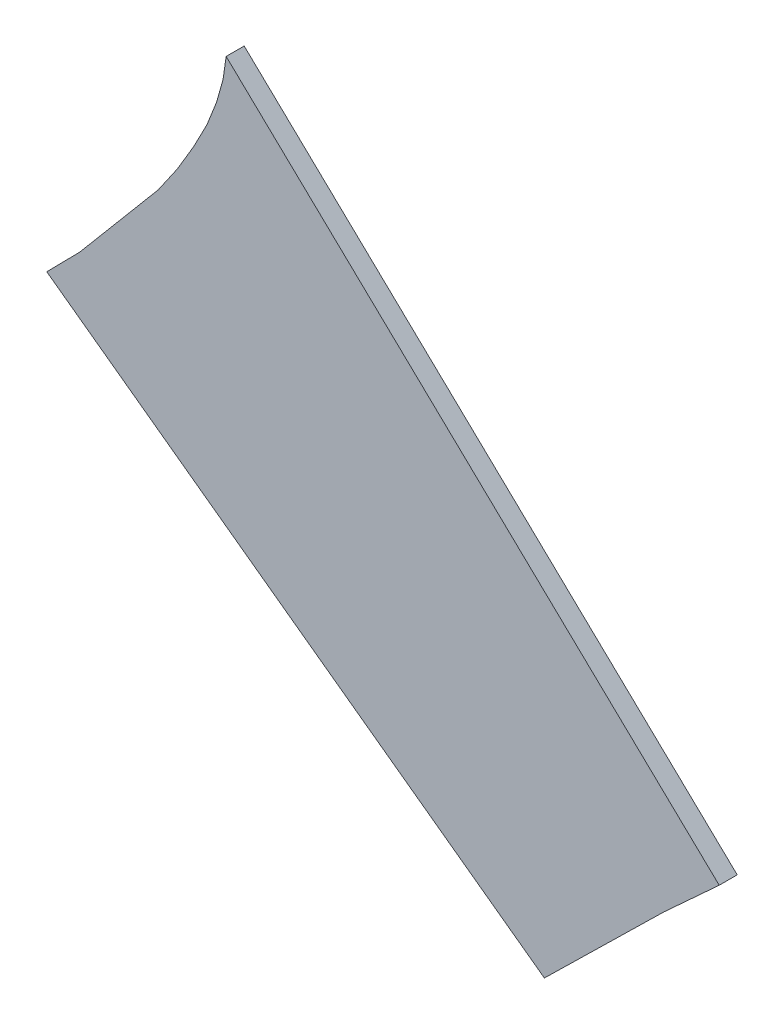
ISO-10303-21;
HEADER;
FILE_DESCRIPTION(('STEP AP214'),'2;1');
FILE_NAME('part.step','',(''),(''),'','','');
FILE_SCHEMA(('AUTOMOTIVE_DESIGN { 1 0 10303 214 1 1 1 1 }'));
ENDSEC;
DATA;
#1=APPLICATION_CONTEXT('core data for automotive mechanical design processes');
#2=APPLICATION_PROTOCOL_DEFINITION('international standard','automotive_design',2000,#1);
#3=PRODUCT_CONTEXT('',#1,'mechanical');
#4=PRODUCT('Part','Part','',(#3));
#5=PRODUCT_RELATED_PRODUCT_CATEGORY('part','',(#4));
#6=PRODUCT_DEFINITION_FORMATION('','',#4);
#7=PRODUCT_DEFINITION_CONTEXT('part definition',#1,'design');
#8=PRODUCT_DEFINITION('design','',#6,#7);
#9=PRODUCT_DEFINITION_SHAPE('','',#8);
#10=(LENGTH_UNIT() NAMED_UNIT(*) SI_UNIT(.MILLI.,.METRE.));
#11=(NAMED_UNIT(*) PLANE_ANGLE_UNIT() SI_UNIT($,.RADIAN.));
#12=(NAMED_UNIT(*) SI_UNIT($,.STERADIAN.) SOLID_ANGLE_UNIT());
#13=UNCERTAINTY_MEASURE_WITH_UNIT(LENGTH_MEASURE(1.E-05),#10,'distance_accuracy_value','');
#14=(GEOMETRIC_REPRESENTATION_CONTEXT(3) GLOBAL_UNCERTAINTY_ASSIGNED_CONTEXT((#13)) GLOBAL_UNIT_ASSIGNED_CONTEXT((#10,
#11,#12)) REPRESENTATION_CONTEXT('',''));
#15=CARTESIAN_POINT('',(0.,0.,0.));
#16=DIRECTION('',(0.,0.,1.));
#17=DIRECTION('',(1.,0.,0.));
#18=AXIS2_PLACEMENT_3D('',#15,#16,#17);
#19=CARTESIAN_POINT('',(85.4899978637695,105.611000061035,0.));
#20=DIRECTION('',(-0.699500203064892,0.714632399148104,0.));
#21=DIRECTION('',(0.714632399148104,0.699500203064892,0.));
#22=AXIS2_PLACEMENT_3D('',#19,#20,#21);
#23=PLANE('',#22);
#24=DIRECTION('',(0.714632399148104,0.699500203064892,0.));
#25=VECTOR('',#24,1.);
#26=CARTESIAN_POINT('',(85.4899978637695,105.611000061035,0.03556));
#27=LINE('',#26,#25);
#28=CARTESIAN_POINT('',(85.4899978637695,105.611000061035,0.03556));
#29=VERTEX_POINT('',#28);
#30=CARTESIAN_POINT('',(85.7259979248047,105.842002868652,0.03556));
#31=VERTEX_POINT('',#30);
#32=EDGE_CURVE('E11',#29,#31,#27,.T.);
#33=ORIENTED_EDGE('',*,*,#32,.F.);
#34=DIRECTION('',(0.,0.,1.));
#35=VECTOR('',#34,1.);
#36=CARTESIAN_POINT('',(85.4899978637695,105.611000061035,0.));
#37=LINE('',#36,#35);
#38=CARTESIAN_POINT('',(85.4899978637695,105.611000061035,0.));
#39=VERTEX_POINT('',#38);
#40=EDGE_CURVE('E24',#39,#29,#37,.T.);
#41=ORIENTED_EDGE('',*,*,#40,.F.);
#42=DIRECTION('',(0.714632399148104,0.699500203064892,0.));
#43=VECTOR('',#42,1.);
#44=CARTESIAN_POINT('',(85.4899978637695,105.611000061035,0.));
#45=LINE('',#44,#43);
#46=CARTESIAN_POINT('',(85.7259979248047,105.842002868652,0.));
#47=VERTEX_POINT('',#46);
#48=EDGE_CURVE('E124',#39,#47,#45,.T.);
#49=ORIENTED_EDGE('',*,*,#48,.T.);
#50=DIRECTION('',(0.,0.,1.));
#51=VECTOR('',#50,1.);
#52=CARTESIAN_POINT('',(85.7259979248047,105.842002868652,0.));
#53=LINE('',#52,#51);
#54=EDGE_CURVE('E37',#47,#31,#53,.T.);
#55=ORIENTED_EDGE('',*,*,#54,.T.);
#56=EDGE_LOOP('',(#33,#41,#49,#55));
#57=FACE_BOUND('',#56,.T.);
#58=ADVANCED_FACE('F17',(#57),#23,.F.);
#59=CARTESIAN_POINT('',(85.7259979248047,105.842002868652,0.));
#60=DIRECTION('',(-0.676021190858393,0.736882181566633,0.));
#61=DIRECTION('',(0.736882181566633,0.676021190858393,0.));
#62=AXIS2_PLACEMENT_3D('',#59,#60,#61);
#63=PLANE('',#62);
#64=DIRECTION('',(0.736882181566633,0.676021190858393,0.));
#65=VECTOR('',#64,1.);
#66=CARTESIAN_POINT('',(85.7259979248047,105.842002868652,0.03556));
#67=LINE('',#66,#65);
#68=CARTESIAN_POINT('',(85.8349990844727,105.942001342773,0.03556));
#69=VERTEX_POINT('',#68);
#70=EDGE_CURVE('E196',#31,#69,#67,.T.);
#71=ORIENTED_EDGE('',*,*,#70,.F.);
#72=ORIENTED_EDGE('',*,*,#54,.F.);
#73=DIRECTION('',(0.736882181566633,0.676021190858393,0.));
#74=VECTOR('',#73,1.);
#75=CARTESIAN_POINT('',(85.7259979248047,105.842002868652,0.));
#76=LINE('',#75,#74);
#77=CARTESIAN_POINT('',(85.8349990844727,105.942001342773,0.));
#78=VERTEX_POINT('',#77);
#79=EDGE_CURVE('E193',#47,#78,#76,.T.);
#80=ORIENTED_EDGE('',*,*,#79,.T.);
#81=DIRECTION('',(0.,0.,1.));
#82=VECTOR('',#81,1.);
#83=CARTESIAN_POINT('',(85.8349990844727,105.942001342773,0.));
#84=LINE('',#83,#82);
#85=EDGE_CURVE('E191',#78,#69,#84,.T.);
#86=ORIENTED_EDGE('',*,*,#85,.T.);
#87=EDGE_LOOP('',(#71,#72,#80,#86));
#88=FACE_BOUND('',#87,.T.);
#89=ADVANCED_FACE('F204',(#88),#63,.F.);
#90=CARTESIAN_POINT('',(85.8349990844727,105.942001342773,0.));
#91=DIRECTION('',(-0.690952974262261,-0.722899707676062,0.));
#92=DIRECTION('',(-0.722899707676062,0.690952974262261,0.));
#93=AXIS2_PLACEMENT_3D('',#90,#91,#92);
#94=PLANE('',#93);
#95=DIRECTION('',(-0.722899707676062,0.690952974262261,0.));
#96=VECTOR('',#95,1.);
#97=CARTESIAN_POINT('',(85.8349990844727,105.942001342773,0.03556));
#98=LINE('',#97,#96);
#99=CARTESIAN_POINT('',(84.8619995117187,106.872001647949,0.03556));
#100=VERTEX_POINT('',#99);
#101=EDGE_CURVE('E188',#69,#100,#98,.T.);
#102=ORIENTED_EDGE('',*,*,#101,.F.);
#103=ORIENTED_EDGE('',*,*,#85,.F.);
#104=DIRECTION('',(-0.722899707676062,0.690952974262261,0.));
#105=VECTOR('',#104,1.);
#106=CARTESIAN_POINT('',(85.8349990844727,105.942001342773,0.));
#107=LINE('',#106,#105);
#108=CARTESIAN_POINT('',(84.8619995117187,106.872001647949,0.));
#109=VERTEX_POINT('',#108);
#110=EDGE_CURVE('E185',#78,#109,#107,.T.);
#111=ORIENTED_EDGE('',*,*,#110,.T.);
#112=DIRECTION('',(0.,0.,1.));
#113=VECTOR('',#112,1.);
#114=CARTESIAN_POINT('',(84.8619995117187,106.872001647949,0.));
#115=LINE('',#114,#113);
#116=EDGE_CURVE('E183',#109,#100,#115,.T.);
#117=ORIENTED_EDGE('',*,*,#116,.T.);
#118=EDGE_LOOP('',(#102,#103,#111,#117));
#119=FACE_BOUND('',#118,.T.);
#120=ADVANCED_FACE('F210',(#119),#94,.F.);
#121=CARTESIAN_POINT('',(84.8619995117188,106.872001647949,0.));
#122=DIRECTION('',(0.989960280537772,-0.141345827520925,0.));
#123=DIRECTION('',(-0.141345827520925,-0.989960280537772,0.));
#124=AXIS2_PLACEMENT_3D('',#121,#122,#123);
#125=PLANE('',#124);
#126=DIRECTION('',(-0.141345827520925,-0.989960280537772,0.));
#127=VECTOR('',#126,1.);
#128=CARTESIAN_POINT('',(84.8619995117187,106.872001647949,0.03556));
#129=LINE('',#128,#127);
#130=CARTESIAN_POINT('',(84.8560028076172,106.830001831055,0.03556));
#131=VERTEX_POINT('',#130);
#132=EDGE_CURVE('E180',#100,#131,#129,.T.);
#133=ORIENTED_EDGE('',*,*,#132,.F.);
#134=ORIENTED_EDGE('',*,*,#116,.F.);
#135=DIRECTION('',(-0.141345827520925,-0.989960280537772,0.));
#136=VECTOR('',#135,1.);
#137=CARTESIAN_POINT('',(84.8619995117187,106.872001647949,0.));
#138=LINE('',#137,#136);
#139=CARTESIAN_POINT('',(84.8560028076172,106.830001831055,0.));
#140=VERTEX_POINT('',#139);
#141=EDGE_CURVE('E177',#109,#140,#138,.T.);
#142=ORIENTED_EDGE('',*,*,#141,.T.);
#143=DIRECTION('',(0.,0.,1.));
#144=VECTOR('',#143,1.);
#145=CARTESIAN_POINT('',(84.8560028076172,106.830001831055,0.));
#146=LINE('',#145,#144);
#147=EDGE_CURVE('E175',#140,#131,#146,.T.);
#148=ORIENTED_EDGE('',*,*,#147,.T.);
#149=EDGE_LOOP('',(#133,#134,#142,#148));
#150=FACE_BOUND('',#149,.T.);
#151=ADVANCED_FACE('F212',(#150),#125,.F.);
#152=CARTESIAN_POINT('',(84.8560028076172,106.830001831055,0.));
#153=DIRECTION('',(0.962314850552555,-0.271937728912364,0.));
#154=DIRECTION('',(-0.271937728912364,-0.962314850552555,0.));
#155=AXIS2_PLACEMENT_3D('',#152,#153,#154);
#156=PLANE('',#155);
#157=DIRECTION('',(-0.271937728912364,-0.962314850552555,0.));
#158=VECTOR('',#157,1.);
#159=CARTESIAN_POINT('',(84.8560028076172,106.830001831055,0.03556));
#160=LINE('',#159,#158);
#161=CARTESIAN_POINT('',(84.8430023193359,106.783996582031,0.03556));
#162=VERTEX_POINT('',#161);
#163=EDGE_CURVE('E172',#131,#162,#160,.T.);
#164=ORIENTED_EDGE('',*,*,#163,.F.);
#165=ORIENTED_EDGE('',*,*,#147,.F.);
#166=DIRECTION('',(-0.271937728912364,-0.962314850552555,0.));
#167=VECTOR('',#166,1.);
#168=CARTESIAN_POINT('',(84.8560028076172,106.830001831055,0.));
#169=LINE('',#168,#167);
#170=CARTESIAN_POINT('',(84.8430023193359,106.783996582031,0.));
#171=VERTEX_POINT('',#170);
#172=EDGE_CURVE('E169',#140,#171,#169,.T.);
#173=ORIENTED_EDGE('',*,*,#172,.T.);
#174=DIRECTION('',(0.,0.,1.));
#175=VECTOR('',#174,1.);
#176=CARTESIAN_POINT('',(84.8430023193359,106.783996582031,0.));
#177=LINE('',#176,#175);
#178=EDGE_CURVE('E167',#171,#162,#177,.T.);
#179=ORIENTED_EDGE('',*,*,#178,.T.);
#180=EDGE_LOOP('',(#164,#165,#173,#179));
#181=FACE_BOUND('',#180,.T.);
#182=ADVANCED_FACE('F217',(#181),#156,.F.);
#183=CARTESIAN_POINT('',(84.8430023193359,106.783996582031,0.));
#184=DIRECTION('',(0.929765513623229,-0.368152264256154,0.));
#185=DIRECTION('',(-0.368152264256154,-0.929765513623229,0.));
#186=AXIS2_PLACEMENT_3D('',#183,#184,#185);
#187=PLANE('',#186);
#188=DIRECTION('',(-0.368152264256154,-0.929765513623229,0.));
#189=VECTOR('',#188,1.);
#190=CARTESIAN_POINT('',(84.8430023193359,106.783996582031,0.03556));
#191=LINE('',#190,#189);
#192=CARTESIAN_POINT('',(84.8239974975586,106.736000061035,0.03556));
#193=VERTEX_POINT('',#192);
#194=EDGE_CURVE('E164',#162,#193,#191,.T.);
#195=ORIENTED_EDGE('',*,*,#194,.F.);
#196=ORIENTED_EDGE('',*,*,#178,.F.);
#197=DIRECTION('',(-0.368152264256154,-0.929765513623229,0.));
#198=VECTOR('',#197,1.);
#199=CARTESIAN_POINT('',(84.8430023193359,106.783996582031,0.));
#200=LINE('',#199,#198);
#201=CARTESIAN_POINT('',(84.8239974975586,106.736000061035,0.));
#202=VERTEX_POINT('',#201);
#203=EDGE_CURVE('E161',#171,#202,#200,.T.);
#204=ORIENTED_EDGE('',*,*,#203,.T.);
#205=DIRECTION('',(0.,0.,1.));
#206=VECTOR('',#205,1.);
#207=CARTESIAN_POINT('',(84.8239974975586,106.736000061035,0.));
#208=LINE('',#207,#206);
#209=EDGE_CURVE('E159',#202,#193,#208,.T.);
#210=ORIENTED_EDGE('',*,*,#209,.T.);
#211=EDGE_LOOP('',(#195,#196,#204,#210));
#212=FACE_BOUND('',#211,.T.);
#213=ADVANCED_FACE('F220',(#212),#187,.F.);
#214=CARTESIAN_POINT('',(84.8239974975586,106.736000061035,0.));
#215=DIRECTION('',(0.887221233995669,-0.46134421200141,0.));
#216=DIRECTION('',(-0.46134421200141,-0.887221233995669,0.));
#217=AXIS2_PLACEMENT_3D('',#214,#215,#216);
#218=PLANE('',#217);
#219=DIRECTION('',(-0.46134421200141,-0.887221233995669,0.));
#220=VECTOR('',#219,1.);
#221=CARTESIAN_POINT('',(84.8239974975586,106.736000061035,0.03556));
#222=LINE('',#221,#220);
#223=CARTESIAN_POINT('',(84.7979965209961,106.685997009277,0.03556));
#224=VERTEX_POINT('',#223);
#225=EDGE_CURVE('E156',#193,#224,#222,.T.);
#226=ORIENTED_EDGE('',*,*,#225,.F.);
#227=ORIENTED_EDGE('',*,*,#209,.F.);
#228=DIRECTION('',(-0.46134421200141,-0.887221233995669,0.));
#229=VECTOR('',#228,1.);
#230=CARTESIAN_POINT('',(84.8239974975586,106.736000061035,0.));
#231=LINE('',#230,#229);
#232=CARTESIAN_POINT('',(84.7979965209961,106.685997009277,0.));
#233=VERTEX_POINT('',#232);
#234=EDGE_CURVE('E153',#202,#233,#231,.T.);
#235=ORIENTED_EDGE('',*,*,#234,.T.);
#236=DIRECTION('',(0.,0.,1.));
#237=VECTOR('',#236,1.);
#238=CARTESIAN_POINT('',(84.7979965209961,106.685997009277,0.));
#239=LINE('',#238,#237);
#240=EDGE_CURVE('E151',#233,#224,#239,.T.);
#241=ORIENTED_EDGE('',*,*,#240,.T.);
#242=EDGE_LOOP('',(#226,#227,#235,#241));
#243=FACE_BOUND('',#242,.T.);
#244=ADVANCED_FACE('F225',(#243),#218,.F.);
#245=CARTESIAN_POINT('',(84.7979965209961,106.685997009277,0.));
#246=DIRECTION('',(0.860279685935763,-0.509822382763119,0.));
#247=DIRECTION('',(-0.509822382763119,-0.860279685935763,0.));
#248=AXIS2_PLACEMENT_3D('',#245,#246,#247);
#249=PLANE('',#248);
#250=DIRECTION('',(-0.509822382763119,-0.860279685935763,0.));
#251=VECTOR('',#250,1.);
#252=CARTESIAN_POINT('',(84.7979965209961,106.685997009277,0.03556));
#253=LINE('',#252,#251);
#254=CARTESIAN_POINT('',(84.765998840332,106.63200378418,0.03556));
#255=VERTEX_POINT('',#254);
#256=EDGE_CURVE('E148',#224,#255,#253,.T.);
#257=ORIENTED_EDGE('',*,*,#256,.F.);
#258=ORIENTED_EDGE('',*,*,#240,.F.);
#259=DIRECTION('',(-0.509822382763119,-0.860279685935763,0.));
#260=VECTOR('',#259,1.);
#261=CARTESIAN_POINT('',(84.7979965209961,106.685997009277,0.));
#262=LINE('',#261,#260);
#263=CARTESIAN_POINT('',(84.765998840332,106.63200378418,0.));
#264=VERTEX_POINT('',#263);
#265=EDGE_CURVE('E145',#233,#264,#262,.T.);
#266=ORIENTED_EDGE('',*,*,#265,.T.);
#267=DIRECTION('',(0.,0.,1.));
#268=VECTOR('',#267,1.);
#269=CARTESIAN_POINT('',(84.765998840332,106.63200378418,0.));
#270=LINE('',#269,#268);
#271=EDGE_CURVE('E143',#264,#255,#270,.T.);
#272=ORIENTED_EDGE('',*,*,#271,.T.);
#273=EDGE_LOOP('',(#257,#258,#266,#272));
#274=FACE_BOUND('',#273,.T.);
#275=ADVANCED_FACE('F228',(#274),#249,.F.);
#276=CARTESIAN_POINT('',(84.765998840332,106.63200378418,0.));
#277=DIRECTION('',(0.822717722740582,-0.568450128585218,0.));
#278=DIRECTION('',(-0.568450128585218,-0.822717722740582,0.));
#279=AXIS2_PLACEMENT_3D('',#276,#277,#278);
#280=PLANE('',#279);
#281=DIRECTION('',(-0.568450128585218,-0.822717722740582,0.));
#282=VECTOR('',#281,1.);
#283=CARTESIAN_POINT('',(84.765998840332,106.63200378418,0.03556));
#284=LINE('',#283,#282);
#285=CARTESIAN_POINT('',(84.7279968261719,106.577003479004,0.03556));
#286=VERTEX_POINT('',#285);
#287=EDGE_CURVE('E140',#255,#286,#284,.T.);
#288=ORIENTED_EDGE('',*,*,#287,.F.);
#289=ORIENTED_EDGE('',*,*,#271,.F.);
#290=DIRECTION('',(-0.568450128585218,-0.822717722740582,0.));
#291=VECTOR('',#290,1.);
#292=CARTESIAN_POINT('',(84.765998840332,106.63200378418,0.));
#293=LINE('',#292,#291);
#294=CARTESIAN_POINT('',(84.7279968261719,106.577003479004,0.));
#295=VERTEX_POINT('',#294);
#296=EDGE_CURVE('E137',#264,#295,#293,.T.);
#297=ORIENTED_EDGE('',*,*,#296,.T.);
#298=DIRECTION('',(0.,0.,1.));
#299=VECTOR('',#298,1.);
#300=CARTESIAN_POINT('',(84.7279968261719,106.577003479004,0.));
#301=LINE('',#300,#299);
#302=EDGE_CURVE('E135',#295,#286,#301,.T.);
#303=ORIENTED_EDGE('',*,*,#302,.T.);
#304=EDGE_LOOP('',(#288,#289,#297,#303));
#305=FACE_BOUND('',#304,.T.);
#306=ADVANCED_FACE('F233',(#305),#280,.F.);
#307=CARTESIAN_POINT('',(84.7279968261719,106.577003479004,0.));
#308=DIRECTION('',(0.764815798517204,-0.644249015783876,0.));
#309=DIRECTION('',(-0.644249015783876,-0.764815798517204,0.));
#310=AXIS2_PLACEMENT_3D('',#307,#308,#309);
#311=PLANE('',#310);
#312=DIRECTION('',(-0.644249015783876,-0.764815798517204,0.));
#313=VECTOR('',#312,1.);
#314=CARTESIAN_POINT('',(84.7279968261719,106.577003479004,0.03556));
#315=LINE('',#314,#313);
#316=CARTESIAN_POINT('',(84.572998046875,106.392997741699,0.03556));
#317=VERTEX_POINT('',#316);
#318=EDGE_CURVE('E132',#286,#317,#315,.T.);
#319=ORIENTED_EDGE('',*,*,#318,.F.);
#320=ORIENTED_EDGE('',*,*,#302,.F.);
#321=DIRECTION('',(-0.644249015783876,-0.764815798517204,0.));
#322=VECTOR('',#321,1.);
#323=CARTESIAN_POINT('',(84.7279968261719,106.577003479004,0.));
#324=LINE('',#323,#322);
#325=CARTESIAN_POINT('',(84.572998046875,106.392997741699,0.));
#326=VERTEX_POINT('',#325);
#327=EDGE_CURVE('E130',#295,#326,#324,.T.);
#328=ORIENTED_EDGE('',*,*,#327,.T.);
#329=DIRECTION('',(0.,0.,1.));
#330=VECTOR('',#329,1.);
#331=CARTESIAN_POINT('',(84.572998046875,106.392997741699,0.));
#332=LINE('',#331,#330);
#333=EDGE_CURVE('E115',#326,#317,#332,.T.);
#334=ORIENTED_EDGE('',*,*,#333,.T.);
#335=EDGE_LOOP('',(#319,#320,#328,#334));
#336=FACE_BOUND('',#335,.T.);
#337=ADVANCED_FACE('F235',(#336),#311,.F.);
#338=CARTESIAN_POINT('',(84.572998046875,106.392997741699,0.));
#339=DIRECTION('',(0.712481288663156,-0.701691109609413,0.));
#340=DIRECTION('',(-0.701691109609413,-0.712481288663156,0.));
#341=AXIS2_PLACEMENT_3D('',#338,#339,#340);
#342=PLANE('',#341);
#343=DIRECTION('',(-0.701691109609413,-0.712481288663156,0.));
#344=VECTOR('',#343,1.);
#345=CARTESIAN_POINT('',(84.572998046875,106.392997741699,0.03556));
#346=LINE('',#345,#344);
#347=CARTESIAN_POINT('',(84.5080032348633,106.327003479004,0.03556));
#348=VERTEX_POINT('',#347);
#349=EDGE_CURVE('E119',#317,#348,#346,.T.);
#350=ORIENTED_EDGE('',*,*,#349,.F.);
#351=ORIENTED_EDGE('',*,*,#333,.F.);
#352=DIRECTION('',(-0.701691109609413,-0.712481288663156,0.));
#353=VECTOR('',#352,1.);
#354=CARTESIAN_POINT('',(84.572998046875,106.392997741699,0.));
#355=LINE('',#354,#353);
#356=CARTESIAN_POINT('',(84.5080032348633,106.327003479004,0.));
#357=VERTEX_POINT('',#356);
#358=EDGE_CURVE('E111',#326,#357,#355,.T.);
#359=ORIENTED_EDGE('',*,*,#358,.T.);
#360=DIRECTION('',(0.,0.,1.));
#361=VECTOR('',#360,1.);
#362=CARTESIAN_POINT('',(84.5080032348633,106.327003479004,0.));
#363=LINE('',#362,#361);
#364=EDGE_CURVE('E101',#357,#348,#363,.T.);
#365=ORIENTED_EDGE('',*,*,#364,.T.);
#366=EDGE_LOOP('',(#350,#351,#359,#365));
#367=FACE_BOUND('',#366,.T.);
#368=ADVANCED_FACE('F114',(#367),#342,.F.);
#369=CARTESIAN_POINT('',(84.5080032348633,106.327003479004,0.));
#370=DIRECTION('',(0.589153713643585,0.808020978502398,0.));
#371=DIRECTION('',(0.808020978502398,-0.589153713643585,0.));
#372=AXIS2_PLACEMENT_3D('',#369,#370,#371);
#373=PLANE('',#372);
#374=DIRECTION('',(0.808020978502398,-0.589153713643585,0.));
#375=VECTOR('',#374,1.);
#376=CARTESIAN_POINT('',(84.5080032348633,106.327003479004,0.03556));
#377=LINE('',#376,#375);
#378=EDGE_CURVE('E107',#348,#29,#377,.T.);
#379=ORIENTED_EDGE('',*,*,#378,.F.);
#380=ORIENTED_EDGE('',*,*,#364,.F.);
#381=DIRECTION('',(0.808020978502398,-0.589153713643585,0.));
#382=VECTOR('',#381,1.);
#383=CARTESIAN_POINT('',(84.5080032348633,106.327003479004,0.));
#384=LINE('',#383,#382);
#385=EDGE_CURVE('E105',#357,#39,#384,.T.);
#386=ORIENTED_EDGE('',*,*,#385,.T.);
#387=ORIENTED_EDGE('',*,*,#40,.T.);
#388=EDGE_LOOP('',(#379,#380,#386,#387));
#389=FACE_BOUND('',#388,.T.);
#390=ADVANCED_FACE('F103',(#389),#373,.F.);
#391=CARTESIAN_POINT('',(85.4899978637695,105.611000061035,0.));
#392=DIRECTION('',(0.,0.,1.));
#393=DIRECTION('',(1.,0.,0.));
#394=AXIS2_PLACEMENT_3D('',#391,#392,#393);
#395=PLANE('',#394);
#396=ORIENTED_EDGE('',*,*,#385,.F.);
#397=ORIENTED_EDGE('',*,*,#358,.F.);
#398=ORIENTED_EDGE('',*,*,#327,.F.);
#399=ORIENTED_EDGE('',*,*,#296,.F.);
#400=ORIENTED_EDGE('',*,*,#265,.F.);
#401=ORIENTED_EDGE('',*,*,#234,.F.);
#402=ORIENTED_EDGE('',*,*,#203,.F.);
#403=ORIENTED_EDGE('',*,*,#172,.F.);
#404=ORIENTED_EDGE('',*,*,#141,.F.);
#405=ORIENTED_EDGE('',*,*,#110,.F.);
#406=ORIENTED_EDGE('',*,*,#79,.F.);
#407=ORIENTED_EDGE('',*,*,#48,.F.);
#408=EDGE_LOOP('',(#396,#397,#398,#399,#400,#401,#402,#403,#404,#405,#406,#407));
#409=FACE_BOUND('',#408,.T.);
#410=ADVANCED_FACE('F122',(#409),#395,.F.);
#411=CARTESIAN_POINT('',(85.4899978637695,105.611000061035,0.03556));
#412=DIRECTION('',(0.,0.,1.));
#413=DIRECTION('',(1.,0.,0.));
#414=AXIS2_PLACEMENT_3D('',#411,#412,#413);
#415=PLANE('',#414);
#416=ORIENTED_EDGE('',*,*,#32,.T.);
#417=ORIENTED_EDGE('',*,*,#70,.T.);
#418=ORIENTED_EDGE('',*,*,#101,.T.);
#419=ORIENTED_EDGE('',*,*,#132,.T.);
#420=ORIENTED_EDGE('',*,*,#163,.T.);
#421=ORIENTED_EDGE('',*,*,#194,.T.);
#422=ORIENTED_EDGE('',*,*,#225,.T.);
#423=ORIENTED_EDGE('',*,*,#256,.T.);
#424=ORIENTED_EDGE('',*,*,#287,.T.);
#425=ORIENTED_EDGE('',*,*,#318,.T.);
#426=ORIENTED_EDGE('',*,*,#349,.T.);
#427=ORIENTED_EDGE('',*,*,#378,.T.);
#428=EDGE_LOOP('',(#416,#417,#418,#419,#420,#421,#422,#423,#424,#425,#426,#427));
#429=FACE_BOUND('',#428,.T.);
#430=ADVANCED_FACE('F207',(#429),#415,.T.);
#431=CLOSED_SHELL('',(#58,#89,#120,#151,#182,#213,#244,#275,#306,#337,#368,#390,#410,#430));
#432=MANIFOLD_SOLID_BREP('B1',#431);
#433=ADVANCED_BREP_SHAPE_REPRESENTATION('',(#18,#432),#14);
#434=SHAPE_DEFINITION_REPRESENTATION(#9,#433);
ENDSEC;
END-ISO-10303-21;
